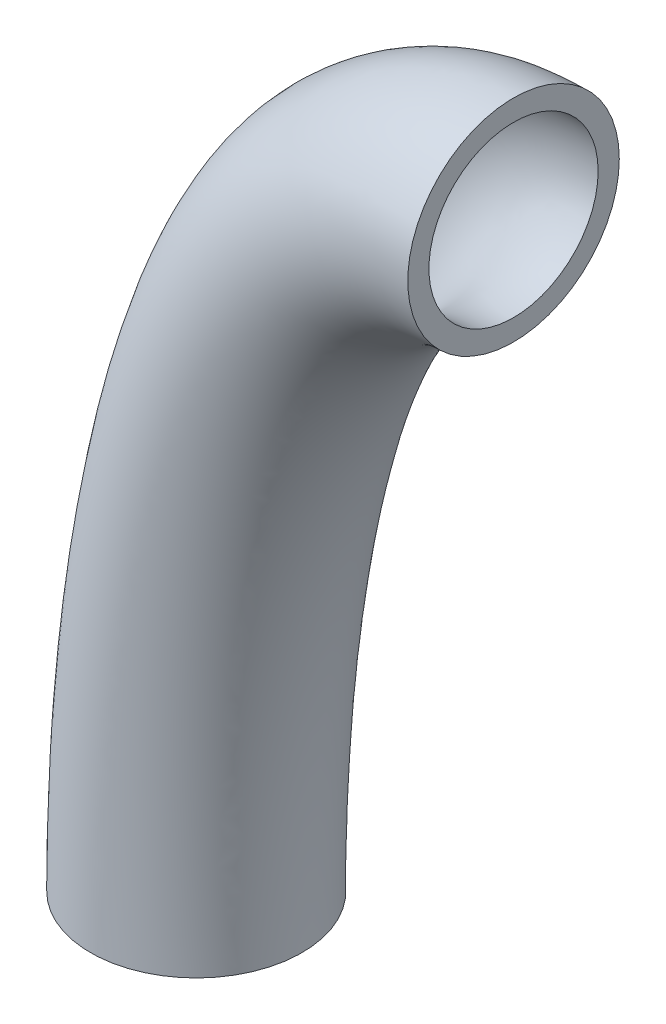
ISO-10303-21;
HEADER;
FILE_DESCRIPTION(('STEP AP214'),'2;1');
FILE_NAME('part.step','',(''),(''),'','','');
FILE_SCHEMA(('AUTOMOTIVE_DESIGN { 1 0 10303 214 1 1 1 1 }'));
ENDSEC;
DATA;
#1=APPLICATION_CONTEXT('core data for automotive mechanical design processes');
#2=APPLICATION_PROTOCOL_DEFINITION('international standard','automotive_design',2000,#1);
#3=PRODUCT_CONTEXT('',#1,'mechanical');
#4=PRODUCT('Part','Part','',(#3));
#5=PRODUCT_RELATED_PRODUCT_CATEGORY('part','',(#4));
#6=PRODUCT_DEFINITION_FORMATION('','',#4);
#7=PRODUCT_DEFINITION_CONTEXT('part definition',#1,'design');
#8=PRODUCT_DEFINITION('design','',#6,#7);
#9=PRODUCT_DEFINITION_SHAPE('','',#8);
#10=(LENGTH_UNIT() NAMED_UNIT(*) SI_UNIT(.MILLI.,.METRE.));
#11=(NAMED_UNIT(*) PLANE_ANGLE_UNIT() SI_UNIT($,.RADIAN.));
#12=(NAMED_UNIT(*) SI_UNIT($,.STERADIAN.) SOLID_ANGLE_UNIT());
#13=UNCERTAINTY_MEASURE_WITH_UNIT(LENGTH_MEASURE(1.E-05),#10,'distance_accuracy_value','');
#14=(GEOMETRIC_REPRESENTATION_CONTEXT(3) GLOBAL_UNCERTAINTY_ASSIGNED_CONTEXT((#13)) GLOBAL_UNIT_ASSIGNED_CONTEXT((#10,
#11,#12)) REPRESENTATION_CONTEXT('',''));
#15=CARTESIAN_POINT('',(0.,0.,0.));
#16=DIRECTION('',(0.,0.,1.));
#17=DIRECTION('',(1.,0.,0.));
#18=AXIS2_PLACEMENT_3D('',#15,#16,#17);
#19=CARTESIAN_POINT('',(-15.,0.,0.194211126427035));
#20=DIRECTION('',(0.,1.,0.));
#21=DIRECTION('',(0.,0.,-1.));
#22=AXIS2_PLACEMENT_3D('',#19,#20,#21);
#23=PLANE('',#22);
#24=CARTESIAN_POINT('',(-15.,0.,0.194211126427035));
#25=DIRECTION('',(0.,1.,0.));
#26=DIRECTION('',(0.,0.,-1.));
#27=AXIS2_PLACEMENT_3D('',#24,#25,#26);
#28=CIRCLE('',#27,4.);
#29=CARTESIAN_POINT('',(-15.,0.,-3.80578887357296));
#30=VERTEX_POINT('',#29);
#31=EDGE_CURVE('E91',#30,#30,#28,.T.);
#32=ORIENTED_EDGE('',*,*,#31,.T.);
#33=EDGE_LOOP('',(#32));
#34=FACE_BOUND('',#33,.T.);
#35=CARTESIAN_POINT('',(-15.,0.,0.194211126427035));
#36=DIRECTION('',(0.,1.,0.));
#37=DIRECTION('',(0.,0.,-1.));
#38=AXIS2_PLACEMENT_3D('',#35,#36,#37);
#39=CIRCLE('',#38,5.00000000000001);
#40=CARTESIAN_POINT('',(-15.,0.,-4.80578887357297));
#41=VERTEX_POINT('',#40);
#42=EDGE_CURVE('E12',#41,#41,#39,.T.);
#43=ORIENTED_EDGE('',*,*,#42,.F.);
#44=EDGE_LOOP('',(#43));
#45=FACE_BOUND('',#44,.T.);
#46=ADVANCED_FACE('F81',(#34,#45),#23,.F.);
#47=CARTESIAN_POINT('',(0.,35.,0.194211126427035));
#48=DIRECTION('',(1.,0.,0.));
#49=DIRECTION('',(0.,0.,-1.));
#50=AXIS2_PLACEMENT_3D('',#47,#48,#49);
#51=PLANE('',#50);
#52=CARTESIAN_POINT('',(0.,35.,0.194211126427035));
#53=DIRECTION('',(1.,0.,0.));
#54=DIRECTION('',(0.,0.,-1.));
#55=AXIS2_PLACEMENT_3D('',#52,#53,#54);
#56=CIRCLE('',#55,4.);
#57=CARTESIAN_POINT('',(0.,35.,-3.80578887357296));
#58=VERTEX_POINT('',#57);
#59=EDGE_CURVE('E110',#58,#58,#56,.T.);
#60=ORIENTED_EDGE('',*,*,#59,.F.);
#61=EDGE_LOOP('',(#60));
#62=FACE_BOUND('',#61,.T.);
#63=CARTESIAN_POINT('',(0.,35.,0.194211126427035));
#64=DIRECTION('',(1.,0.,0.));
#65=DIRECTION('',(0.,0.,-1.));
#66=AXIS2_PLACEMENT_3D('',#63,#64,#65);
#67=CIRCLE('',#66,5.00000000000001);
#68=CARTESIAN_POINT('',(0.,35.,-4.80578887357297));
#69=VERTEX_POINT('',#68);
#70=EDGE_CURVE('E113',#69,#69,#67,.T.);
#71=ORIENTED_EDGE('',*,*,#70,.T.);
#72=EDGE_LOOP('',(#71));
#73=FACE_BOUND('',#72,.T.);
#74=ADVANCED_FACE('F127',(#62,#73),#51,.T.);
#75=CARTESIAN_POINT('',(0.,35.,-4.80578887357297));
#76=CARTESIAN_POINT('',(-0.499415352205051,34.9837236701867,-4.80578887357297));
#77=CARTESIAN_POINT('',(-1.50341022260542,34.9153731125377,-4.80578887357297));
#78=CARTESIAN_POINT('',(-2.94247749242482,34.5081344684632,-4.80578887357297));
#79=CARTESIAN_POINT('',(-4.26989266413881,33.8954559327914,-4.80578887357297));
#80=CARTESIAN_POINT('',(-5.46951021808138,33.1065928831538,-4.80578887357297));
#81=CARTESIAN_POINT('',(-6.54746105418784,32.1800278844408,-4.80578887357297));
#82=CARTESIAN_POINT('',(-7.19660483755474,31.4810291445689,-4.80578887357297));
#83=CARTESIAN_POINT('',(-8.1239915997632,30.3801031641797,-4.80578887357297));
#84=CARTESIAN_POINT('',(-9.23526746294053,28.7701921662488,-4.80578887357297));
#85=CARTESIAN_POINT('',(-10.6372110912438,26.0085726693533,-4.80578887357297));
#86=CARTESIAN_POINT('',(-11.4443767148581,23.9034153392661,-4.80578887357297));
#87=CARTESIAN_POINT('',(-12.554699476638,20.5761961185095,-4.80578887357297));
#88=CARTESIAN_POINT('',(-13.4597668194105,16.9232226616745,-4.80578887357297));
#89=CARTESIAN_POINT('',(-14.0810778839338,13.0128783125782,-4.80578887357297));
#90=CARTESIAN_POINT('',(-14.4284124875849,10.3831395456038,-4.80578887357297));
#91=CARTESIAN_POINT('',(-14.8502062519462,6.41189982862167,-4.80578887357297));
#92=CARTESIAN_POINT('',(-14.9973591376145,2.49039594118896,-4.80578887357297));
#93=CARTESIAN_POINT('',(-15.,0.,-4.80578887357297));
#94=CARTESIAN_POINT('',(0.,25.,-4.80578887357297));
#95=CARTESIAN_POINT('',(0.10657825154586,25.0162763298133,-4.80578887357297));
#96=CARTESIAN_POINT('',(0.314570588647314,25.0130310914173,-4.80578887357297));
#97=CARTESIAN_POINT('',(0.536063050009442,25.0884628491276,-4.80578887357297));
#98=CARTESIAN_POINT('',(0.629746392189609,25.1352955019765,-4.80578887357297));
#99=CARTESIAN_POINT('',(0.586889082955132,25.1146478681708,-4.80578887357297));
#100=CARTESIAN_POINT('',(0.421036009673709,24.9784115786583,-4.80578887357297));
#101=CARTESIAN_POINT('',(0.245033814263564,24.7935985204176,-4.80578887357297));
#102=CARTESIAN_POINT('',(-0.0585489273667822,24.4325356970846,-4.80578887357297));
#103=CARTESIAN_POINT('',(-0.567175060059417,23.7253346008536,-4.80578887357297));
#104=CARTESIAN_POINT('',(-1.46051207210787,21.9915174297909,-4.80578887357297));
#105=CARTESIAN_POINT('',(-2.04688508928742,20.475612990683,-4.80578887357297));
#106=CARTESIAN_POINT('',(-2.88918378626383,17.9449678351706,-4.80578887357297));
#107=CARTESIAN_POINT('',(-3.65255675392998,14.9139579011303,-4.80578887357297));
#108=CARTESIAN_POINT('',(-4.18980173648762,11.5347432688118,-4.80578887357297));
#109=CARTESIAN_POINT('',(-4.49223993449078,9.24060402043134,-4.80578887357297));
#110=CARTESIAN_POINT('',(-4.86341056387384,5.74503314245352,-4.80578887357297));
#111=CARTESIAN_POINT('',(-5.00264086238551,2.2236492667217,-4.80578887357297));
#112=CARTESIAN_POINT('',(-4.99999999999999,0.,-4.80578887357297));
#113=CARTESIAN_POINT('',(0.,25.,5.19421112642704));
#114=CARTESIAN_POINT('',(0.10657825154586,25.0162763298133,5.19421112642704));
#115=CARTESIAN_POINT('',(0.314570588647314,25.0130310914173,5.19421112642704));
#116=CARTESIAN_POINT('',(0.536063050009442,25.0884628491276,5.19421112642704));
#117=CARTESIAN_POINT('',(0.629746392189609,25.1352955019765,5.19421112642704));
#118=CARTESIAN_POINT('',(0.586889082955132,25.1146478681708,5.19421112642704));
#119=CARTESIAN_POINT('',(0.421036009673709,24.9784115786583,5.19421112642704));
#120=CARTESIAN_POINT('',(0.245033814263564,24.7935985204176,5.19421112642704));
#121=CARTESIAN_POINT('',(-0.0585489273667822,24.4325356970846,5.19421112642704));
#122=CARTESIAN_POINT('',(-0.567175060059417,23.7253346008536,5.19421112642704));
#123=CARTESIAN_POINT('',(-1.46051207210787,21.9915174297909,5.19421112642704));
#124=CARTESIAN_POINT('',(-2.04688508928742,20.475612990683,5.19421112642704));
#125=CARTESIAN_POINT('',(-2.88918378626383,17.9449678351706,5.19421112642704));
#126=CARTESIAN_POINT('',(-3.65255675392998,14.9139579011303,5.19421112642704));
#127=CARTESIAN_POINT('',(-4.18980173648762,11.5347432688118,5.19421112642704));
#128=CARTESIAN_POINT('',(-4.49223993449078,9.24060402043134,5.19421112642704));
#129=CARTESIAN_POINT('',(-4.86341056387384,5.74503314245352,5.19421112642704));
#130=CARTESIAN_POINT('',(-5.00264086238551,2.2236492667217,5.19421112642704));
#131=CARTESIAN_POINT('',(-4.99999999999999,0.,5.19421112642704));
#132=CARTESIAN_POINT('',(0.,35.,5.19421112642704));
#133=CARTESIAN_POINT('',(-0.499415352205051,34.9837236701867,5.19421112642704));
#134=CARTESIAN_POINT('',(-1.50341022260542,34.9153731125377,5.19421112642704));
#135=CARTESIAN_POINT('',(-2.94247749242482,34.5081344684632,5.19421112642704));
#136=CARTESIAN_POINT('',(-4.26989266413881,33.8954559327914,5.19421112642704));
#137=CARTESIAN_POINT('',(-5.46951021808138,33.1065928831538,5.19421112642704));
#138=CARTESIAN_POINT('',(-6.54746105418784,32.1800278844408,5.19421112642704));
#139=CARTESIAN_POINT('',(-7.19660483755474,31.4810291445689,5.19421112642704));
#140=CARTESIAN_POINT('',(-8.1239915997632,30.3801031641797,5.19421112642704));
#141=CARTESIAN_POINT('',(-9.23526746294053,28.7701921662488,5.19421112642704));
#142=CARTESIAN_POINT('',(-10.6372110912438,26.0085726693533,5.19421112642704));
#143=CARTESIAN_POINT('',(-11.4443767148581,23.9034153392661,5.19421112642704));
#144=CARTESIAN_POINT('',(-12.554699476638,20.5761961185095,5.19421112642704));
#145=CARTESIAN_POINT('',(-13.4597668194105,16.9232226616745,5.19421112642704));
#146=CARTESIAN_POINT('',(-14.0810778839338,13.0128783125782,5.19421112642704));
#147=CARTESIAN_POINT('',(-14.4284124875849,10.3831395456038,5.19421112642704));
#148=CARTESIAN_POINT('',(-14.8502062519462,6.41189982862167,5.19421112642704));
#149=CARTESIAN_POINT('',(-14.9973591376145,2.49039594118896,5.19421112642704));
#150=CARTESIAN_POINT('',(-15.,0.,5.19421112642704));
#151=CARTESIAN_POINT('',(0.,45.,5.19421112642704));
#152=CARTESIAN_POINT('',(-1.10540895595596,44.9511710105602,5.19421112642704));
#153=CARTESIAN_POINT('',(-3.32139103385815,44.8177151336581,5.19421112642704));
#154=CARTESIAN_POINT('',(-6.42101803485908,43.9278060877989,5.19421112642704));
#155=CARTESIAN_POINT('',(-9.16953172046723,42.6556163636063,5.19421112642704));
#156=CARTESIAN_POINT('',(-11.5259095191179,41.0985378981367,5.19421112642704));
#157=CARTESIAN_POINT('',(-13.5159581180494,39.3816441902233,5.19421112642704));
#158=CARTESIAN_POINT('',(-14.638243489373,38.1684597687203,5.19421112642704));
#159=CARTESIAN_POINT('',(-16.1894342721596,36.3276706312747,5.19421112642704));
#160=CARTESIAN_POINT('',(-17.9033598658216,33.8150497316441,5.19421112642704));
#161=CARTESIAN_POINT('',(-19.8139101103797,30.0256279089157,5.19421112642704));
#162=CARTESIAN_POINT('',(-20.8418683404287,27.3312176878492,5.19421112642704));
#163=CARTESIAN_POINT('',(-22.2202151670122,23.2074244018484,5.19421112642704));
#164=CARTESIAN_POINT('',(-23.266976884891,18.9324874222186,5.19421112642704));
#165=CARTESIAN_POINT('',(-23.97235403138,14.4910133563446,5.19421112642704));
#166=CARTESIAN_POINT('',(-24.3645850406791,11.5256750707762,5.19421112642704));
#167=CARTESIAN_POINT('',(-24.8370019400186,7.07876651478983,5.19421112642704));
#168=CARTESIAN_POINT('',(-24.9920774128434,2.75714261565621,5.19421112642704));
#169=CARTESIAN_POINT('',(-25.,0.,5.19421112642704));
#170=CARTESIAN_POINT('',(0.,45.,-4.80578887357297));
#171=CARTESIAN_POINT('',(-1.10540895595596,44.9511710105602,-4.80578887357297));
#172=CARTESIAN_POINT('',(-3.32139103385815,44.8177151336581,-4.80578887357297));
#173=CARTESIAN_POINT('',(-6.42101803485908,43.9278060877989,-4.80578887357297));
#174=CARTESIAN_POINT('',(-9.16953172046723,42.6556163636063,-4.80578887357297));
#175=CARTESIAN_POINT('',(-11.5259095191179,41.0985378981367,-4.80578887357297));
#176=CARTESIAN_POINT('',(-13.5159581180494,39.3816441902233,-4.80578887357297));
#177=CARTESIAN_POINT('',(-14.638243489373,38.1684597687203,-4.80578887357297));
#178=CARTESIAN_POINT('',(-16.1894342721596,36.3276706312747,-4.80578887357297));
#179=CARTESIAN_POINT('',(-17.9033598658216,33.8150497316441,-4.80578887357297));
#180=CARTESIAN_POINT('',(-19.8139101103797,30.0256279089157,-4.80578887357297));
#181=CARTESIAN_POINT('',(-20.8418683404287,27.3312176878492,-4.80578887357297));
#182=CARTESIAN_POINT('',(-22.2202151670122,23.2074244018484,-4.80578887357297));
#183=CARTESIAN_POINT('',(-23.266976884891,18.9324874222186,-4.80578887357297));
#184=CARTESIAN_POINT('',(-23.97235403138,14.4910133563446,-4.80578887357297));
#185=CARTESIAN_POINT('',(-24.3645850406791,11.5256750707762,-4.80578887357297));
#186=CARTESIAN_POINT('',(-24.8370019400186,7.07876651478983,-4.80578887357297));
#187=CARTESIAN_POINT('',(-24.9920774128434,2.75714261565621,-4.80578887357297));
#188=CARTESIAN_POINT('',(-25.,0.,-4.80578887357297));
#189=CARTESIAN_POINT('',(0.,35.,-4.80578887357297));
#190=CARTESIAN_POINT('',(-0.499415352205051,34.9837236701867,-4.80578887357297));
#191=CARTESIAN_POINT('',(-1.50341022260542,34.9153731125377,-4.80578887357297));
#192=CARTESIAN_POINT('',(-2.94247749242482,34.5081344684632,-4.80578887357297));
#193=CARTESIAN_POINT('',(-4.26989266413881,33.8954559327914,-4.80578887357297));
#194=CARTESIAN_POINT('',(-5.46951021808138,33.1065928831538,-4.80578887357297));
#195=CARTESIAN_POINT('',(-6.54746105418784,32.1800278844408,-4.80578887357297));
#196=CARTESIAN_POINT('',(-7.19660483755474,31.4810291445689,-4.80578887357297));
#197=CARTESIAN_POINT('',(-8.1239915997632,30.3801031641797,-4.80578887357297));
#198=CARTESIAN_POINT('',(-9.23526746294053,28.7701921662488,-4.80578887357297));
#199=CARTESIAN_POINT('',(-10.6372110912438,26.0085726693533,-4.80578887357297));
#200=CARTESIAN_POINT('',(-11.4443767148581,23.9034153392661,-4.80578887357297));
#201=CARTESIAN_POINT('',(-12.554699476638,20.5761961185095,-4.80578887357297));
#202=CARTESIAN_POINT('',(-13.4597668194105,16.9232226616745,-4.80578887357297));
#203=CARTESIAN_POINT('',(-14.0810778839338,13.0128783125782,-4.80578887357297));
#204=CARTESIAN_POINT('',(-14.4284124875849,10.3831395456038,-4.80578887357297));
#205=CARTESIAN_POINT('',(-14.8502062519462,6.41189982862167,-4.80578887357297));
#206=CARTESIAN_POINT('',(-14.9973591376145,2.49039594118896,-4.80578887357297));
#207=CARTESIAN_POINT('',(-15.,0.,-4.80578887357297));
#208=(BOUNDED_SURFACE() B_SPLINE_SURFACE(3,3,((#75,#76,#77,#78,#79,#80,#81,#82,#83,#84,#85,#86,
#87,#88,#89,#90,#91,#92,#93),(#94,#95,#96,#97,#98,#99,#100,#101,#102,#103,#104,#105,#106,#107,
#108,#109,#110,#111,#112),(#113,#114,#115,#116,#117,#118,#119,#120,#121,#122,#123,#124,#125,
#126,#127,#128,#129,#130,#131),(#132,#133,#134,#135,#136,#137,#138,#139,#140,#141,#142,#143,
#144,#145,#146,#147,#148,#149,#150),(#151,#152,#153,#154,#155,#156,#157,#158,#159,#160,#161,
#162,#163,#164,#165,#166,#167,#168,#169),(#170,#171,#172,#173,#174,#175,#176,#177,#178,#179,
#180,#181,#182,#183,#184,#185,#186,#187,#188),(#189,#190,#191,#192,#193,#194,#195,#196,#197,
#198,#199,#200,#201,#202,#203,#204,#205,#206,#207)),.UNSPECIFIED.,.T.,.F.,
.F.) B_SPLINE_SURFACE_WITH_KNOTS((4,3,4),(4,1,1,1,1,1,2,1,1,2,1,2,1,4),(0.,0.5,1.),(0.,
0.0416666666666667,0.0833333333333335,0.125,0.1666666666667,0.208333333333334,0.25,
0.333333333333334,0.416666666666667,0.5,0.666666666666667,0.75,0.833333333333322,1.),
.UNSPECIFIED.) GEOMETRIC_REPRESENTATION_ITEM() RATIONAL_B_SPLINE_SURFACE(((1.,1.,1.,1.,1.,1.,1.,
1.,1.,1.,1.,1.,1.,1.,1.,1.,1.,1.,1.),(0.333333333333333,0.333333333333333,0.333333333333333,
0.333333333333333,0.333333333333333,0.333333333333333,0.333333333333333,0.333333333333333,
0.333333333333333,0.333333333333333,0.333333333333333,0.333333333333333,0.333333333333333,
0.333333333333333,0.333333333333333,0.333333333333333,0.333333333333333,0.333333333333333,
0.333333333333333),(0.333333333333333,0.333333333333333,0.333333333333333,0.333333333333333,
0.333333333333333,0.333333333333333,0.333333333333333,0.333333333333333,0.333333333333333,
0.333333333333333,0.333333333333333,0.333333333333333,0.333333333333333,0.333333333333333,
0.333333333333333,0.333333333333333,0.333333333333333,0.333333333333333,0.333333333333333),(1.,
1.,1.,1.,1.,1.,1.,1.,1.,1.,1.,1.,1.,1.,1.,1.,1.,1.,1.),(0.333333333333333,0.333333333333333,
0.333333333333333,0.333333333333333,0.333333333333333,0.333333333333333,0.333333333333333,
0.333333333333333,0.333333333333333,0.333333333333333,0.333333333333333,0.333333333333333,
0.333333333333333,0.333333333333333,0.333333333333333,0.333333333333333,0.333333333333333,
0.333333333333333,0.333333333333333),(0.333333333333333,0.333333333333333,0.333333333333333,
0.333333333333333,0.333333333333333,0.333333333333333,0.333333333333333,0.333333333333333,
0.333333333333333,0.333333333333333,0.333333333333333,0.333333333333333,0.333333333333333,
0.333333333333333,0.333333333333333,0.333333333333333,0.333333333333333,0.333333333333333,
0.333333333333333),(1.,1.,1.,1.,1.,1.,1.,1.,1.,1.,1.,1.,1.,1.,1.,1.,1.,1.,1.))) REPRESENTATION_ITEM('') SURFACE());
#209=CARTESIAN_POINT('',(0.,35.,-4.80578887357297));
#210=CARTESIAN_POINT('',(-0.499415352205051,34.9837236701867,-4.80578887357297));
#211=CARTESIAN_POINT('',(-1.50341022260542,34.9153731125377,-4.80578887357297));
#212=CARTESIAN_POINT('',(-2.94247749242482,34.5081344684632,-4.80578887357297));
#213=CARTESIAN_POINT('',(-4.26989266413881,33.8954559327914,-4.80578887357297));
#214=CARTESIAN_POINT('',(-5.46951021808138,33.1065928831538,-4.80578887357297));
#215=CARTESIAN_POINT('',(-6.54746105418784,32.1800278844408,-4.80578887357297));
#216=CARTESIAN_POINT('',(-7.19660483755474,31.4810291445689,-4.80578887357297));
#217=CARTESIAN_POINT('',(-8.1239915997632,30.3801031641797,-4.80578887357297));
#218=CARTESIAN_POINT('',(-9.23526746294053,28.7701921662488,-4.80578887357297));
#219=CARTESIAN_POINT('',(-10.6372110912438,26.0085726693533,-4.80578887357297));
#220=CARTESIAN_POINT('',(-11.4443767148581,23.9034153392661,-4.80578887357297));
#221=CARTESIAN_POINT('',(-12.554699476638,20.5761961185095,-4.80578887357297));
#222=CARTESIAN_POINT('',(-13.4597668194105,16.9232226616745,-4.80578887357297));
#223=CARTESIAN_POINT('',(-14.0810778839338,13.0128783125782,-4.80578887357297));
#224=CARTESIAN_POINT('',(-14.4284124875849,10.3831395456038,-4.80578887357297));
#225=CARTESIAN_POINT('',(-14.8502062519462,6.41189982862167,-4.80578887357297));
#226=CARTESIAN_POINT('',(-14.9973591376145,2.49039594118896,-4.80578887357297));
#227=CARTESIAN_POINT('',(-15.,0.,-4.80578887357297));
#228=B_SPLINE_CURVE_WITH_KNOTS('',3,(#209,#210,#211,#212,#213,#214,#215,#216,#217,#218,#219,
#220,#221,#222,#223,#224,#225,#226,#227),.UNSPECIFIED.,.F.,.F.,(4,1,1,1,1,1,2,1,1,2,1,2,1,4),
(0.,0.0416666666666667,0.0833333333333335,0.125,0.1666666666667,0.208333333333334,0.25,
0.333333333333334,0.416666666666667,0.5,0.666666666666667,0.75,0.833333333333322,1.),.UNSPECIFIED.);
#229=EDGE_CURVE('E84',#69,#41,#228,.T.);
#230=ORIENTED_EDGE('',*,*,#70,.F.);
#231=ORIENTED_EDGE('',*,*,#229,.T.);
#232=ORIENTED_EDGE('',*,*,#42,.T.);
#233=ORIENTED_EDGE('',*,*,#229,.F.);
#234=EDGE_LOOP('',(#230,#231,#232,#233));
#235=FACE_BOUND('',#234,.T.);
#236=ADVANCED_FACE('F124',(#235),#208,.T.);
#237=CARTESIAN_POINT('',(0.,35.,-3.80578887357296));
#238=CARTESIAN_POINT('',(-0.499415352205051,34.9837236701867,-3.80578887357296));
#239=CARTESIAN_POINT('',(-1.50341022260542,34.9153731125377,-3.80578887357296));
#240=CARTESIAN_POINT('',(-2.94247749242482,34.5081344684632,-3.80578887357296));
#241=CARTESIAN_POINT('',(-4.26989266413881,33.8954559327914,-3.80578887357296));
#242=CARTESIAN_POINT('',(-5.46951021808138,33.1065928831538,-3.80578887357296));
#243=CARTESIAN_POINT('',(-6.54746105418784,32.1800278844408,-3.80578887357296));
#244=CARTESIAN_POINT('',(-7.19660483755474,31.4810291445689,-3.80578887357296));
#245=CARTESIAN_POINT('',(-8.1239915997632,30.3801031641797,-3.80578887357297));
#246=CARTESIAN_POINT('',(-9.23526746294053,28.7701921662488,-3.80578887357297));
#247=CARTESIAN_POINT('',(-10.6372110912438,26.0085726693533,-3.80578887357297));
#248=CARTESIAN_POINT('',(-11.4443767148581,23.9034153392661,-3.80578887357296));
#249=CARTESIAN_POINT('',(-12.554699476638,20.5761961185095,-3.80578887357296));
#250=CARTESIAN_POINT('',(-13.4597668194105,16.9232226616745,-3.80578887357296));
#251=CARTESIAN_POINT('',(-14.0810778839338,13.0128783125782,-3.80578887357296));
#252=CARTESIAN_POINT('',(-14.4284124875849,10.3831395456038,-3.80578887357297));
#253=CARTESIAN_POINT('',(-14.8502062519462,6.41189982862167,-3.80578887357297));
#254=CARTESIAN_POINT('',(-14.9973591376145,2.49039594118896,-3.80578887357297));
#255=CARTESIAN_POINT('',(-15.,0.,-3.80578887357296));
#256=CARTESIAN_POINT('',(0.,27.,-3.80578887357297));
#257=CARTESIAN_POINT('',(-0.0146204692043232,27.009765797888,-3.80578887357297));
#258=CARTESIAN_POINT('',(-0.0490255736032342,26.9934994956414,-3.80578887357296));
#259=CARTESIAN_POINT('',(-0.159645058477413,26.9723971729947,-3.80578887357297));
#260=CARTESIAN_POINT('',(-0.350181419076078,26.8873275881394,-3.80578887357296));
#261=CARTESIAN_POINT('',(-0.624390777252177,26.7130368711674,-3.80578887357297));
#262=CARTESIAN_POINT('',(-0.972663403098605,26.4187348398148,-3.80578887357296));
#263=CARTESIAN_POINT('',(-1.2432939161001,26.1310846452479,-3.80578887357296));
#264=CARTESIAN_POINT('',(-1.67163746184607,25.6220491905037,-3.80578887357297));
#265=CARTESIAN_POINT('',(-2.30079354063564,24.7343061139326,-3.80578887357297));
#266=CARTESIAN_POINT('',(-3.29585187593506,22.7949284777034,-3.80578887357296));
#267=CARTESIAN_POINT('',(-3.92638341440156,21.1611734603997,-3.80578887357297));
#268=CARTESIAN_POINT('',(-4.82228692433867,18.4712134918384,-3.80578887357297));
#269=CARTESIAN_POINT('',(-5.6139987670261,15.3158108532392,-3.80578887357297));
#270=CARTESIAN_POINT('',(-6.16805696597687,11.8303702775651,-3.80578887357296));
#271=CARTESIAN_POINT('',(-6.47947444510962,9.46911112546582,-3.80578887357296));
#272=CARTESIAN_POINT('',(-6.86076970148832,5.87840647968715,-3.80578887357296));
#273=CARTESIAN_POINT('',(-7.00158451743131,2.27699860161515,-3.80578887357297));
#274=CARTESIAN_POINT('',(-7.,0.,-3.80578887357297));
#275=CARTESIAN_POINT('',(0.,27.,4.19421112642704));
#276=CARTESIAN_POINT('',(-0.0146204692043232,27.009765797888,4.19421112642704));
#277=CARTESIAN_POINT('',(-0.0490255736032342,26.9934994956414,4.19421112642704));
#278=CARTESIAN_POINT('',(-0.159645058477413,26.9723971729947,4.19421112642704));
#279=CARTESIAN_POINT('',(-0.350181419076078,26.8873275881394,4.19421112642704));
#280=CARTESIAN_POINT('',(-0.624390777252177,26.7130368711674,4.19421112642704));
#281=CARTESIAN_POINT('',(-0.972663403098605,26.4187348398148,4.19421112642704));
#282=CARTESIAN_POINT('',(-1.2432939161001,26.1310846452479,4.19421112642704));
#283=CARTESIAN_POINT('',(-1.67163746184607,25.6220491905037,4.19421112642704));
#284=CARTESIAN_POINT('',(-2.30079354063564,24.7343061139326,4.19421112642704));
#285=CARTESIAN_POINT('',(-3.29585187593506,22.7949284777034,4.19421112642704));
#286=CARTESIAN_POINT('',(-3.92638341440156,21.1611734603997,4.19421112642704));
#287=CARTESIAN_POINT('',(-4.82228692433867,18.4712134918384,4.19421112642704));
#288=CARTESIAN_POINT('',(-5.6139987670261,15.3158108532392,4.19421112642704));
#289=CARTESIAN_POINT('',(-6.16805696597687,11.8303702775651,4.19421112642704));
#290=CARTESIAN_POINT('',(-6.47947444510962,9.46911112546582,4.19421112642704));
#291=CARTESIAN_POINT('',(-6.86076970148832,5.87840647968715,4.19421112642704));
#292=CARTESIAN_POINT('',(-7.00158451743131,2.27699860161515,4.19421112642704));
#293=CARTESIAN_POINT('',(-7.,0.,4.19421112642704));
#294=CARTESIAN_POINT('',(0.,35.,4.19421112642704));
#295=CARTESIAN_POINT('',(-0.499415352205051,34.9837236701867,4.19421112642704));
#296=CARTESIAN_POINT('',(-1.50341022260542,34.9153731125377,4.19421112642704));
#297=CARTESIAN_POINT('',(-2.94247749242482,34.5081344684632,4.19421112642703));
#298=CARTESIAN_POINT('',(-4.26989266413881,33.8954559327914,4.19421112642704));
#299=CARTESIAN_POINT('',(-5.46951021808138,33.1065928831538,4.19421112642703));
#300=CARTESIAN_POINT('',(-6.54746105418784,32.1800278844408,4.19421112642703));
#301=CARTESIAN_POINT('',(-7.19660483755474,31.4810291445689,4.19421112642704));
#302=CARTESIAN_POINT('',(-8.1239915997632,30.3801031641797,4.19421112642704));
#303=CARTESIAN_POINT('',(-9.23526746294053,28.7701921662488,4.19421112642704));
#304=CARTESIAN_POINT('',(-10.6372110912438,26.0085726693533,4.19421112642704));
#305=CARTESIAN_POINT('',(-11.4443767148581,23.9034153392661,4.19421112642704));
#306=CARTESIAN_POINT('',(-12.554699476638,20.5761961185095,4.19421112642703));
#307=CARTESIAN_POINT('',(-13.4597668194105,16.9232226616745,4.19421112642704));
#308=CARTESIAN_POINT('',(-14.0810778839338,13.0128783125782,4.19421112642704));
#309=CARTESIAN_POINT('',(-14.4284124875849,10.3831395456038,4.19421112642704));
#310=CARTESIAN_POINT('',(-14.8502062519462,6.41189982862167,4.19421112642704));
#311=CARTESIAN_POINT('',(-14.9973591376145,2.49039594118896,4.19421112642704));
#312=CARTESIAN_POINT('',(-15.,0.,4.19421112642704));
#313=CARTESIAN_POINT('',(0.,43.,4.19421112642703));
#314=CARTESIAN_POINT('',(-0.98421023520578,42.9576815424855,4.19421112642704));
#315=CARTESIAN_POINT('',(-2.95779487160761,42.837246729434,4.19421112642703));
#316=CARTESIAN_POINT('',(-5.72530992637223,42.0438717639318,4.19421112642703));
#317=CARTESIAN_POINT('',(-8.18960390920154,40.9035842774433,4.19421112642703));
#318=CARTESIAN_POINT('',(-10.3146296589106,39.5001488951401,4.19421112642703));
#319=CARTESIAN_POINT('',(-12.1222587052771,37.9413209290668,4.19421112642703));
#320=CARTESIAN_POINT('',(-13.1499157590094,36.83097364389,4.19421112642703));
#321=CARTESIAN_POINT('',(-14.5763457376803,35.1381571378557,4.19421112642703));
#322=CARTESIAN_POINT('',(-16.1697413852454,32.8060782185651,4.19421112642704));
#323=CARTESIAN_POINT('',(-17.9785703065525,29.2222168610032,4.19421112642703));
#324=CARTESIAN_POINT('',(-18.9623700153146,26.6456572181326,4.19421112642703));
#325=CARTESIAN_POINT('',(-20.2871120289373,22.6811787451806,4.19421112642703));
#326=CARTESIAN_POINT('',(-21.3055348717949,18.5306344701098,4.19421112642703));
#327=CARTESIAN_POINT('',(-21.9940988018908,14.1953863475913,4.19421112642703));
#328=CARTESIAN_POINT('',(-22.3773505300603,11.2971679657417,4.19421112642703));
#329=CARTESIAN_POINT('',(-22.8396428024041,6.9453931775562,4.19421112642703));
#330=CARTESIAN_POINT('',(-22.9931337577976,2.70379328076276,4.19421112642703));
#331=CARTESIAN_POINT('',(-23.,0.,4.19421112642703));
#332=CARTESIAN_POINT('',(0.,43.,-3.80578887357297));
#333=CARTESIAN_POINT('',(-0.98421023520578,42.9576815424855,-3.80578887357297));
#334=CARTESIAN_POINT('',(-2.95779487160761,42.837246729434,-3.80578887357296));
#335=CARTESIAN_POINT('',(-5.72530992637223,42.0438717639318,-3.80578887357297));
#336=CARTESIAN_POINT('',(-8.18960390920154,40.9035842774433,-3.80578887357296));
#337=CARTESIAN_POINT('',(-10.3146296589106,39.5001488951401,-3.80578887357297));
#338=CARTESIAN_POINT('',(-12.1222587052771,37.9413209290668,-3.80578887357296));
#339=CARTESIAN_POINT('',(-13.1499157590094,36.83097364389,-3.80578887357296));
#340=CARTESIAN_POINT('',(-14.5763457376803,35.1381571378557,-3.80578887357297));
#341=CARTESIAN_POINT('',(-16.1697413852454,32.8060782185651,-3.80578887357297));
#342=CARTESIAN_POINT('',(-17.9785703065525,29.2222168610032,-3.80578887357296));
#343=CARTESIAN_POINT('',(-18.9623700153146,26.6456572181326,-3.80578887357297));
#344=CARTESIAN_POINT('',(-20.2871120289373,22.6811787451806,-3.80578887357297));
#345=CARTESIAN_POINT('',(-21.3055348717949,18.5306344701098,-3.80578887357297));
#346=CARTESIAN_POINT('',(-21.9940988018908,14.1953863475913,-3.80578887357296));
#347=CARTESIAN_POINT('',(-22.3773505300603,11.2971679657417,-3.80578887357296));
#348=CARTESIAN_POINT('',(-22.8396428024041,6.9453931775562,-3.80578887357296));
#349=CARTESIAN_POINT('',(-22.9931337577976,2.70379328076276,-3.80578887357297));
#350=CARTESIAN_POINT('',(-23.,0.,-3.80578887357297));
#351=CARTESIAN_POINT('',(0.,35.,-3.80578887357296));
#352=CARTESIAN_POINT('',(-0.499415352205051,34.9837236701867,-3.80578887357296));
#353=CARTESIAN_POINT('',(-1.50341022260542,34.9153731125377,-3.80578887357296));
#354=CARTESIAN_POINT('',(-2.94247749242482,34.5081344684632,-3.80578887357296));
#355=CARTESIAN_POINT('',(-4.26989266413881,33.8954559327914,-3.80578887357296));
#356=CARTESIAN_POINT('',(-5.46951021808138,33.1065928831538,-3.80578887357296));
#357=CARTESIAN_POINT('',(-6.54746105418784,32.1800278844408,-3.80578887357296));
#358=CARTESIAN_POINT('',(-7.19660483755474,31.4810291445689,-3.80578887357296));
#359=CARTESIAN_POINT('',(-8.1239915997632,30.3801031641797,-3.80578887357297));
#360=CARTESIAN_POINT('',(-9.23526746294053,28.7701921662488,-3.80578887357297));
#361=CARTESIAN_POINT('',(-10.6372110912438,26.0085726693533,-3.80578887357297));
#362=CARTESIAN_POINT('',(-11.4443767148581,23.9034153392661,-3.80578887357296));
#363=CARTESIAN_POINT('',(-12.554699476638,20.5761961185095,-3.80578887357296));
#364=CARTESIAN_POINT('',(-13.4597668194105,16.9232226616745,-3.80578887357296));
#365=CARTESIAN_POINT('',(-14.0810778839338,13.0128783125782,-3.80578887357296));
#366=CARTESIAN_POINT('',(-14.4284124875849,10.3831395456038,-3.80578887357297));
#367=CARTESIAN_POINT('',(-14.8502062519462,6.41189982862167,-3.80578887357297));
#368=CARTESIAN_POINT('',(-14.9973591376145,2.49039594118896,-3.80578887357297));
#369=CARTESIAN_POINT('',(-15.,0.,-3.80578887357296));
#370=(BOUNDED_SURFACE() B_SPLINE_SURFACE(3,3,((#237,#238,#239,#240,#241,#242,#243,#244,#245,
#246,#247,#248,#249,#250,#251,#252,#253,#254,#255),(#256,#257,#258,#259,#260,#261,#262,#263,
#264,#265,#266,#267,#268,#269,#270,#271,#272,#273,#274),(#275,#276,#277,#278,#279,#280,#281,
#282,#283,#284,#285,#286,#287,#288,#289,#290,#291,#292,#293),(#294,#295,#296,#297,#298,#299,
#300,#301,#302,#303,#304,#305,#306,#307,#308,#309,#310,#311,#312),(#313,#314,#315,#316,#317,
#318,#319,#320,#321,#322,#323,#324,#325,#326,#327,#328,#329,#330,#331),(#332,#333,#334,#335,
#336,#337,#338,#339,#340,#341,#342,#343,#344,#345,#346,#347,#348,#349,#350),(#351,#352,#353,
#354,#355,#356,#357,#358,#359,#360,#361,#362,#363,#364,#365,#366,#367,#368,#369)),.UNSPECIFIED.,
.T.,.F.,.F.) B_SPLINE_SURFACE_WITH_KNOTS((4,3,4),(4,1,1,1,1,1,2,1,1,2,1,2,1,4),(0.,0.5,1.),(0.,
0.0416666666666667,0.0833333333333335,0.125,0.1666666666667,0.208333333333334,0.25,
0.333333333333334,0.416666666666667,0.5,0.666666666666667,0.75,0.833333333333322,1.),
.UNSPECIFIED.) GEOMETRIC_REPRESENTATION_ITEM() RATIONAL_B_SPLINE_SURFACE(((1.,1.,1.,1.,1.,1.,1.,
1.,1.,1.,1.,1.,1.,1.,1.,1.,1.,1.,1.),(0.333333333333333,0.333333333333333,0.333333333333333,
0.333333333333333,0.333333333333333,0.333333333333333,0.333333333333333,0.333333333333333,
0.333333333333333,0.333333333333333,0.333333333333333,0.333333333333333,0.333333333333333,
0.333333333333333,0.333333333333333,0.333333333333333,0.333333333333333,0.333333333333333,
0.333333333333333),(0.333333333333333,0.333333333333333,0.333333333333333,0.333333333333333,
0.333333333333333,0.333333333333333,0.333333333333333,0.333333333333333,0.333333333333333,
0.333333333333333,0.333333333333333,0.333333333333333,0.333333333333333,0.333333333333333,
0.333333333333333,0.333333333333333,0.333333333333333,0.333333333333333,0.333333333333333),(1.,
1.,1.,1.,1.,1.,1.,1.,1.,1.,1.,1.,1.,1.,1.,1.,1.,1.,1.),(0.333333333333333,0.333333333333333,
0.333333333333333,0.333333333333333,0.333333333333333,0.333333333333333,0.333333333333333,
0.333333333333333,0.333333333333333,0.333333333333333,0.333333333333333,0.333333333333333,
0.333333333333333,0.333333333333333,0.333333333333333,0.333333333333333,0.333333333333333,
0.333333333333333,0.333333333333333),(0.333333333333333,0.333333333333333,0.333333333333333,
0.333333333333333,0.333333333333333,0.333333333333333,0.333333333333333,0.333333333333333,
0.333333333333333,0.333333333333333,0.333333333333333,0.333333333333333,0.333333333333333,
0.333333333333333,0.333333333333333,0.333333333333333,0.333333333333333,0.333333333333333,
0.333333333333333),(1.,1.,1.,1.,1.,1.,1.,1.,1.,1.,1.,1.,1.,1.,1.,1.,1.,1.,1.))) REPRESENTATION_ITEM('') SURFACE());
#371=CARTESIAN_POINT('',(0.,35.,-3.80578887357296));
#372=CARTESIAN_POINT('',(-0.499415352205051,34.9837236701867,-3.80578887357296));
#373=CARTESIAN_POINT('',(-1.50341022260542,34.9153731125377,-3.80578887357296));
#374=CARTESIAN_POINT('',(-2.94247749242482,34.5081344684632,-3.80578887357296));
#375=CARTESIAN_POINT('',(-4.26989266413881,33.8954559327914,-3.80578887357296));
#376=CARTESIAN_POINT('',(-5.46951021808138,33.1065928831538,-3.80578887357296));
#377=CARTESIAN_POINT('',(-6.54746105418784,32.1800278844408,-3.80578887357296));
#378=CARTESIAN_POINT('',(-7.19660483755474,31.4810291445689,-3.80578887357296));
#379=CARTESIAN_POINT('',(-8.1239915997632,30.3801031641797,-3.80578887357297));
#380=CARTESIAN_POINT('',(-9.23526746294053,28.7701921662488,-3.80578887357297));
#381=CARTESIAN_POINT('',(-10.6372110912438,26.0085726693533,-3.80578887357297));
#382=CARTESIAN_POINT('',(-11.4443767148581,23.9034153392661,-3.80578887357296));
#383=CARTESIAN_POINT('',(-12.554699476638,20.5761961185095,-3.80578887357296));
#384=CARTESIAN_POINT('',(-13.4597668194105,16.9232226616745,-3.80578887357296));
#385=CARTESIAN_POINT('',(-14.0810778839338,13.0128783125782,-3.80578887357296));
#386=CARTESIAN_POINT('',(-14.4284124875849,10.3831395456038,-3.80578887357297));
#387=CARTESIAN_POINT('',(-14.8502062519462,6.41189982862167,-3.80578887357297));
#388=CARTESIAN_POINT('',(-14.9973591376145,2.49039594118896,-3.80578887357297));
#389=CARTESIAN_POINT('',(-15.,0.,-3.80578887357296));
#390=B_SPLINE_CURVE_WITH_KNOTS('',3,(#371,#372,#373,#374,#375,#376,#377,#378,#379,#380,#381,
#382,#383,#384,#385,#386,#387,#388,#389),.UNSPECIFIED.,.F.,.F.,(4,1,1,1,1,1,2,1,1,2,1,2,1,4),
(0.,0.0416666666666667,0.0833333333333335,0.125,0.1666666666667,0.208333333333334,0.25,
0.333333333333334,0.416666666666667,0.5,0.666666666666667,0.75,0.833333333333322,1.),.UNSPECIFIED.);
#391=EDGE_CURVE('E104',#58,#30,#390,.T.);
#392=ORIENTED_EDGE('',*,*,#59,.T.);
#393=ORIENTED_EDGE('',*,*,#391,.T.);
#394=ORIENTED_EDGE('',*,*,#31,.F.);
#395=ORIENTED_EDGE('',*,*,#391,.F.);
#396=EDGE_LOOP('',(#392,#393,#394,#395));
#397=FACE_BOUND('',#396,.T.);
#398=ADVANCED_FACE('F111',(#397),#370,.F.);
#399=CLOSED_SHELL('',(#46,#74,#236,#398));
#400=MANIFOLD_SOLID_BREP('B2',#399);
#401=ADVANCED_BREP_SHAPE_REPRESENTATION('',(#18,#400),#14);
#402=SHAPE_DEFINITION_REPRESENTATION(#9,#401);
ENDSEC;
END-ISO-10303-21;
